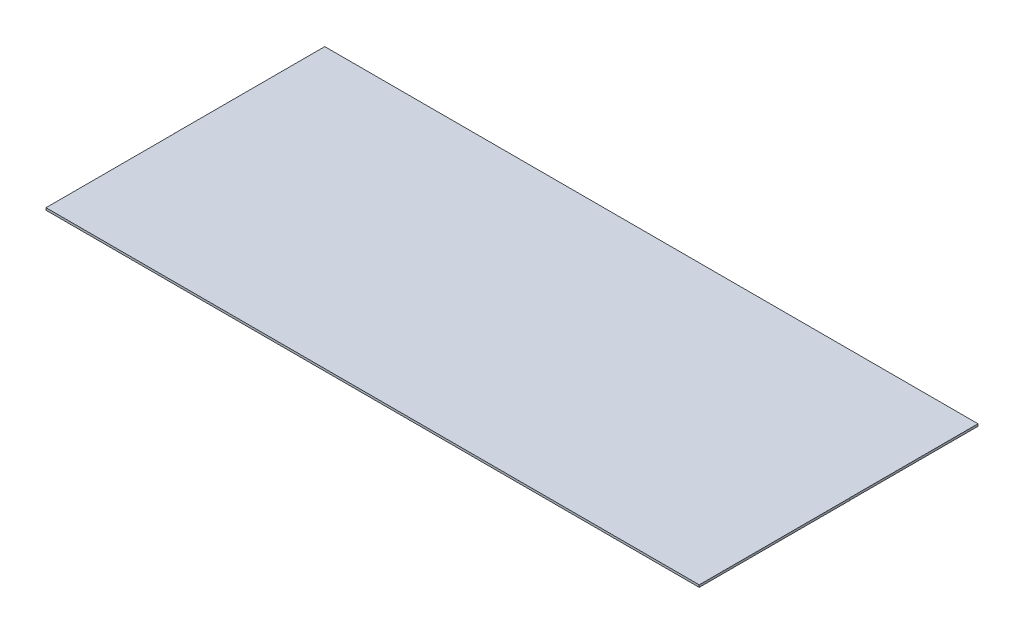
ISO-10303-21;
HEADER;
FILE_DESCRIPTION(('STEP AP214'),'2;1');
FILE_NAME('part.step','',(''),(''),'','','');
FILE_SCHEMA(('AUTOMOTIVE_DESIGN { 1 0 10303 214 1 1 1 1 }'));
ENDSEC;
DATA;
#1=APPLICATION_CONTEXT('core data for automotive mechanical design processes');
#2=APPLICATION_PROTOCOL_DEFINITION('international standard','automotive_design',2000,#1);
#3=PRODUCT_CONTEXT('',#1,'mechanical');
#4=PRODUCT('Part','Part','',(#3));
#5=PRODUCT_RELATED_PRODUCT_CATEGORY('part','',(#4));
#6=PRODUCT_DEFINITION_FORMATION('','',#4);
#7=PRODUCT_DEFINITION_CONTEXT('part definition',#1,'design');
#8=PRODUCT_DEFINITION('design','',#6,#7);
#9=PRODUCT_DEFINITION_SHAPE('','',#8);
#10=(LENGTH_UNIT() NAMED_UNIT(*) SI_UNIT(.MILLI.,.METRE.));
#11=(NAMED_UNIT(*) PLANE_ANGLE_UNIT() SI_UNIT($,.RADIAN.));
#12=(NAMED_UNIT(*) SI_UNIT($,.STERADIAN.) SOLID_ANGLE_UNIT());
#13=UNCERTAINTY_MEASURE_WITH_UNIT(LENGTH_MEASURE(1.E-05),#10,'distance_accuracy_value','');
#14=(GEOMETRIC_REPRESENTATION_CONTEXT(3) GLOBAL_UNCERTAINTY_ASSIGNED_CONTEXT((#13)) GLOBAL_UNIT_ASSIGNED_CONTEXT((#10,
#11,#12)) REPRESENTATION_CONTEXT('',''));
#15=CARTESIAN_POINT('',(0.,0.,0.));
#16=DIRECTION('',(0.,0.,1.));
#17=DIRECTION('',(1.,0.,0.));
#18=AXIS2_PLACEMENT_3D('',#15,#16,#17);
#19=CARTESIAN_POINT('',(28.265,17.385,25.));
#20=DIRECTION('',(0.,1.,0.));
#21=DIRECTION('',(0.,0.,1.));
#22=AXIS2_PLACEMENT_3D('',#19,#20,#21);
#23=PLANE('',#22);
#24=DIRECTION('',(0.,0.,-1.));
#25=VECTOR('',#24,1.);
#26=CARTESIAN_POINT('',(29.29,17.385,25.));
#27=LINE('',#26,#25);
#28=CARTESIAN_POINT('',(29.29,17.385,25.));
#29=VERTEX_POINT('',#28);
#30=CARTESIAN_POINT('',(29.29,17.385,11.55));
#31=VERTEX_POINT('',#30);
#32=EDGE_CURVE('E123',#29,#31,#27,.T.);
#33=ORIENTED_EDGE('',*,*,#32,.F.);
#34=DIRECTION('',(1.,0.,0.));
#35=VECTOR('',#34,1.);
#36=CARTESIAN_POINT('',(-29.27,17.385,25.));
#37=LINE('',#36,#35);
#38=CARTESIAN_POINT('',(-29.27,17.385,25.));
#39=VERTEX_POINT('',#38);
#40=EDGE_CURVE('E117',#39,#29,#37,.T.);
#41=ORIENTED_EDGE('',*,*,#40,.F.);
#42=DIRECTION('',(0.,0.,1.));
#43=VECTOR('',#42,1.);
#44=CARTESIAN_POINT('',(-29.27,17.385,11.55));
#45=LINE('',#44,#43);
#46=CARTESIAN_POINT('',(-29.27,17.385,13.45));
#47=VERTEX_POINT('',#46);
#48=EDGE_CURVE('E114',#47,#39,#45,.T.);
#49=ORIENTED_EDGE('',*,*,#48,.F.);
#50=DIRECTION('',(1.,0.,0.));
#51=VECTOR('',#50,1.);
#52=CARTESIAN_POINT('',(-29.28,17.385,13.45));
#53=LINE('',#52,#51);
#54=CARTESIAN_POINT('',(-29.28,17.385,13.45));
#55=VERTEX_POINT('',#54);
#56=EDGE_CURVE('E109',#55,#47,#53,.T.);
#57=ORIENTED_EDGE('',*,*,#56,.F.);
#58=DIRECTION('',(0.,0.,1.));
#59=VECTOR('',#58,1.);
#60=CARTESIAN_POINT('',(-29.28,17.385,0.));
#61=LINE('',#60,#59);
#62=CARTESIAN_POINT('',(-29.28,17.385,0.));
#63=VERTEX_POINT('',#62);
#64=EDGE_CURVE('E80',#63,#55,#61,.T.);
#65=ORIENTED_EDGE('',*,*,#64,.F.);
#66=DIRECTION('',(-1.,0.,0.));
#67=VECTOR('',#66,1.);
#68=CARTESIAN_POINT('',(29.28,17.385,0.));
#69=LINE('',#68,#67);
#70=CARTESIAN_POINT('',(29.28,17.385,0.));
#71=VERTEX_POINT('',#70);
#72=EDGE_CURVE('E83',#71,#63,#69,.T.);
#73=ORIENTED_EDGE('',*,*,#72,.F.);
#74=DIRECTION('',(0.,0.,-1.));
#75=VECTOR('',#74,1.);
#76=CARTESIAN_POINT('',(29.28,17.385,13.45));
#77=LINE('',#76,#75);
#78=CARTESIAN_POINT('',(29.28,17.385,11.55));
#79=VERTEX_POINT('',#78);
#80=EDGE_CURVE('E85',#79,#71,#77,.T.);
#81=ORIENTED_EDGE('',*,*,#80,.F.);
#82=DIRECTION('',(1.,0.,0.));
#83=VECTOR('',#82,1.);
#84=CARTESIAN_POINT('',(28.265,17.385,11.55));
#85=LINE('',#84,#83);
#86=EDGE_CURVE('E20',#31,#79,#85,.F.);
#87=ORIENTED_EDGE('',*,*,#86,.F.);
#88=EDGE_LOOP('',(#33,#41,#49,#57,#65,#73,#81,#87));
#89=FACE_BOUND('',#88,.T.);
#90=ADVANCED_FACE('F17',(#89),#23,.F.);
#91=CARTESIAN_POINT('',(29.28,17.385,13.45));
#92=DIRECTION('',(1.,0.,0.));
#93=DIRECTION('',(0.,0.,-1.));
#94=AXIS2_PLACEMENT_3D('',#91,#92,#93);
#95=PLANE('',#94);
#96=DIRECTION('',(0.,1.,0.));
#97=VECTOR('',#96,1.);
#98=CARTESIAN_POINT('',(29.28,17.385,0.));
#99=LINE('',#98,#97);
#100=CARTESIAN_POINT('',(29.28,17.585,0.));
#101=VERTEX_POINT('',#100);
#102=EDGE_CURVE('E90',#101,#71,#99,.F.);
#103=ORIENTED_EDGE('',*,*,#102,.F.);
#104=DIRECTION('',(0.,0.,1.));
#105=VECTOR('',#104,1.);
#106=CARTESIAN_POINT('',(29.28,17.585,25.));
#107=LINE('',#106,#105);
#108=CARTESIAN_POINT('',(29.28,17.585,11.55));
#109=VERTEX_POINT('',#108);
#110=EDGE_CURVE('E130',#109,#101,#107,.F.);
#111=ORIENTED_EDGE('',*,*,#110,.F.);
#112=DIRECTION('',(0.,1.,0.));
#113=VECTOR('',#112,1.);
#114=CARTESIAN_POINT('',(29.28,17.385,11.55));
#115=LINE('',#114,#113);
#116=EDGE_CURVE('E96',#79,#109,#115,.T.);
#117=ORIENTED_EDGE('',*,*,#116,.F.);
#118=ORIENTED_EDGE('',*,*,#80,.T.);
#119=EDGE_LOOP('',(#103,#111,#117,#118));
#120=FACE_BOUND('',#119,.T.);
#121=ADVANCED_FACE('F93',(#120),#95,.T.);
#122=CARTESIAN_POINT('',(29.28,17.385,0.));
#123=DIRECTION('',(0.,0.,-1.));
#124=DIRECTION('',(-1.,0.,0.));
#125=AXIS2_PLACEMENT_3D('',#122,#123,#124);
#126=PLANE('',#125);
#127=DIRECTION('',(1.,0.,0.));
#128=VECTOR('',#127,1.);
#129=CARTESIAN_POINT('',(28.265,17.585,0.));
#130=LINE('',#129,#128);
#131=CARTESIAN_POINT('',(-29.28,17.585,0.));
#132=VERTEX_POINT('',#131);
#133=EDGE_CURVE('E99',#101,#132,#130,.F.);
#134=ORIENTED_EDGE('',*,*,#133,.F.);
#135=ORIENTED_EDGE('',*,*,#102,.T.);
#136=ORIENTED_EDGE('',*,*,#72,.T.);
#137=DIRECTION('',(0.,1.,0.));
#138=VECTOR('',#137,1.);
#139=CARTESIAN_POINT('',(-29.28,17.385,0.));
#140=LINE('',#139,#138);
#141=EDGE_CURVE('E102',#132,#63,#140,.F.);
#142=ORIENTED_EDGE('',*,*,#141,.F.);
#143=EDGE_LOOP('',(#134,#135,#136,#142));
#144=FACE_BOUND('',#143,.T.);
#145=ADVANCED_FACE('F97',(#144),#126,.T.);
#146=CARTESIAN_POINT('',(-29.28,17.385,0.));
#147=DIRECTION('',(-1.,0.,0.));
#148=DIRECTION('',(0.,0.,1.));
#149=AXIS2_PLACEMENT_3D('',#146,#147,#148);
#150=PLANE('',#149);
#151=DIRECTION('',(0.,0.,1.));
#152=VECTOR('',#151,1.);
#153=CARTESIAN_POINT('',(-29.28,17.585,25.));
#154=LINE('',#153,#152);
#155=CARTESIAN_POINT('',(-29.28,17.585,13.45));
#156=VERTEX_POINT('',#155);
#157=EDGE_CURVE('E133',#132,#156,#154,.T.);
#158=ORIENTED_EDGE('',*,*,#157,.F.);
#159=ORIENTED_EDGE('',*,*,#141,.T.);
#160=ORIENTED_EDGE('',*,*,#64,.T.);
#161=DIRECTION('',(0.,1.,0.));
#162=VECTOR('',#161,1.);
#163=CARTESIAN_POINT('',(-29.28,17.385,13.45));
#164=LINE('',#163,#162);
#165=EDGE_CURVE('E106',#156,#55,#164,.F.);
#166=ORIENTED_EDGE('',*,*,#165,.F.);
#167=EDGE_LOOP('',(#158,#159,#160,#166));
#168=FACE_BOUND('',#167,.T.);
#169=ADVANCED_FACE('F161',(#168),#150,.T.);
#170=CARTESIAN_POINT('',(-29.28,17.385,13.45));
#171=DIRECTION('',(0.,0.,1.));
#172=DIRECTION('',(1.,0.,0.));
#173=AXIS2_PLACEMENT_3D('',#170,#171,#172);
#174=PLANE('',#173);
#175=ORIENTED_EDGE('',*,*,#165,.T.);
#176=ORIENTED_EDGE('',*,*,#56,.T.);
#177=DIRECTION('',(0.,1.,0.));
#178=VECTOR('',#177,1.);
#179=CARTESIAN_POINT('',(-29.27,17.385,13.45));
#180=LINE('',#179,#178);
#181=CARTESIAN_POINT('',(-29.27,17.585,13.45));
#182=VERTEX_POINT('',#181);
#183=EDGE_CURVE('E111',#182,#47,#180,.F.);
#184=ORIENTED_EDGE('',*,*,#183,.F.);
#185=DIRECTION('',(1.,0.,0.));
#186=VECTOR('',#185,1.);
#187=CARTESIAN_POINT('',(28.265,17.585,13.45));
#188=LINE('',#187,#186);
#189=EDGE_CURVE('E136',#156,#182,#188,.T.);
#190=ORIENTED_EDGE('',*,*,#189,.F.);
#191=EDGE_LOOP('',(#175,#176,#184,#190));
#192=FACE_BOUND('',#191,.T.);
#193=ADVANCED_FACE('F158',(#192),#174,.T.);
#194=CARTESIAN_POINT('',(-29.27,17.385,11.55));
#195=DIRECTION('',(-1.,0.,0.));
#196=DIRECTION('',(0.,0.,1.));
#197=AXIS2_PLACEMENT_3D('',#194,#195,#196);
#198=PLANE('',#197);
#199=DIRECTION('',(0.,1.,0.));
#200=VECTOR('',#199,1.);
#201=CARTESIAN_POINT('',(-29.27,17.385,25.));
#202=LINE('',#201,#200);
#203=CARTESIAN_POINT('',(-29.27,17.585,25.));
#204=VERTEX_POINT('',#203);
#205=EDGE_CURVE('E120',#204,#39,#202,.F.);
#206=ORIENTED_EDGE('',*,*,#205,.F.);
#207=DIRECTION('',(0.,0.,1.));
#208=VECTOR('',#207,1.);
#209=CARTESIAN_POINT('',(-29.27,17.585,25.));
#210=LINE('',#209,#208);
#211=EDGE_CURVE('E139',#182,#204,#210,.T.);
#212=ORIENTED_EDGE('',*,*,#211,.F.);
#213=ORIENTED_EDGE('',*,*,#183,.T.);
#214=ORIENTED_EDGE('',*,*,#48,.T.);
#215=EDGE_LOOP('',(#206,#212,#213,#214));
#216=FACE_BOUND('',#215,.T.);
#217=ADVANCED_FACE('F154',(#216),#198,.T.);
#218=CARTESIAN_POINT('',(-29.27,17.385,25.));
#219=DIRECTION('',(0.,0.,1.));
#220=DIRECTION('',(1.,0.,0.));
#221=AXIS2_PLACEMENT_3D('',#218,#219,#220);
#222=PLANE('',#221);
#223=DIRECTION('',(1.,0.,0.));
#224=VECTOR('',#223,1.);
#225=CARTESIAN_POINT('',(28.265,17.585,25.));
#226=LINE('',#225,#224);
#227=CARTESIAN_POINT('',(29.29,17.585,25.));
#228=VERTEX_POINT('',#227);
#229=EDGE_CURVE('E142',#204,#228,#226,.T.);
#230=ORIENTED_EDGE('',*,*,#229,.F.);
#231=ORIENTED_EDGE('',*,*,#205,.T.);
#232=ORIENTED_EDGE('',*,*,#40,.T.);
#233=DIRECTION('',(0.,1.,0.));
#234=VECTOR('',#233,1.);
#235=CARTESIAN_POINT('',(29.29,17.385,25.));
#236=LINE('',#235,#234);
#237=EDGE_CURVE('E125',#228,#29,#236,.F.);
#238=ORIENTED_EDGE('',*,*,#237,.F.);
#239=EDGE_LOOP('',(#230,#231,#232,#238));
#240=FACE_BOUND('',#239,.T.);
#241=ADVANCED_FACE('F151',(#240),#222,.T.);
#242=CARTESIAN_POINT('',(29.29,17.385,25.));
#243=DIRECTION('',(1.,0.,0.));
#244=DIRECTION('',(0.,0.,-1.));
#245=AXIS2_PLACEMENT_3D('',#242,#243,#244);
#246=PLANE('',#245);
#247=DIRECTION('',(0.,0.,1.));
#248=VECTOR('',#247,1.);
#249=CARTESIAN_POINT('',(29.29,17.585,25.));
#250=LINE('',#249,#248);
#251=CARTESIAN_POINT('',(29.29,17.585,11.55));
#252=VERTEX_POINT('',#251);
#253=EDGE_CURVE('E26',#228,#252,#250,.F.);
#254=ORIENTED_EDGE('',*,*,#253,.F.);
#255=ORIENTED_EDGE('',*,*,#237,.T.);
#256=ORIENTED_EDGE('',*,*,#32,.T.);
#257=DIRECTION('',(0.,1.,0.));
#258=VECTOR('',#257,1.);
#259=CARTESIAN_POINT('',(29.29,17.385,11.55));
#260=LINE('',#259,#258);
#261=EDGE_CURVE('E35',#252,#31,#260,.F.);
#262=ORIENTED_EDGE('',*,*,#261,.F.);
#263=EDGE_LOOP('',(#254,#255,#256,#262));
#264=FACE_BOUND('',#263,.T.);
#265=ADVANCED_FACE('F149',(#264),#246,.T.);
#266=CARTESIAN_POINT('',(29.29,17.385,11.55));
#267=DIRECTION('',(0.,0.,-1.));
#268=DIRECTION('',(-1.,0.,0.));
#269=AXIS2_PLACEMENT_3D('',#266,#267,#268);
#270=PLANE('',#269);
#271=ORIENTED_EDGE('',*,*,#261,.T.);
#272=ORIENTED_EDGE('',*,*,#86,.T.);
#273=ORIENTED_EDGE('',*,*,#116,.T.);
#274=DIRECTION('',(1.,0.,0.));
#275=VECTOR('',#274,1.);
#276=CARTESIAN_POINT('',(28.265,17.585,11.55));
#277=LINE('',#276,#275);
#278=EDGE_CURVE('E11',#252,#109,#277,.F.);
#279=ORIENTED_EDGE('',*,*,#278,.F.);
#280=EDGE_LOOP('',(#271,#272,#273,#279));
#281=FACE_BOUND('',#280,.T.);
#282=ADVANCED_FACE('F163',(#281),#270,.T.);
#283=CARTESIAN_POINT('',(28.265,17.585,25.));
#284=DIRECTION('',(0.,1.,0.));
#285=DIRECTION('',(0.,0.,1.));
#286=AXIS2_PLACEMENT_3D('',#283,#284,#285);
#287=PLANE('',#286);
#288=ORIENTED_EDGE('',*,*,#253,.T.);
#289=ORIENTED_EDGE('',*,*,#278,.T.);
#290=ORIENTED_EDGE('',*,*,#110,.T.);
#291=ORIENTED_EDGE('',*,*,#133,.T.);
#292=ORIENTED_EDGE('',*,*,#157,.T.);
#293=ORIENTED_EDGE('',*,*,#189,.T.);
#294=ORIENTED_EDGE('',*,*,#211,.T.);
#295=ORIENTED_EDGE('',*,*,#229,.T.);
#296=EDGE_LOOP('',(#288,#289,#290,#291,#292,#293,#294,#295));
#297=FACE_BOUND('',#296,.T.);
#298=ADVANCED_FACE('F147',(#297),#287,.T.);
#299=CLOSED_SHELL('',(#90,#121,#145,#169,#193,#217,#241,#265,#282,#298));
#300=MANIFOLD_SOLID_BREP('B1',#299);
#301=ADVANCED_BREP_SHAPE_REPRESENTATION('',(#18,#300),#14);
#302=SHAPE_DEFINITION_REPRESENTATION(#9,#301);
ENDSEC;
END-ISO-10303-21;
